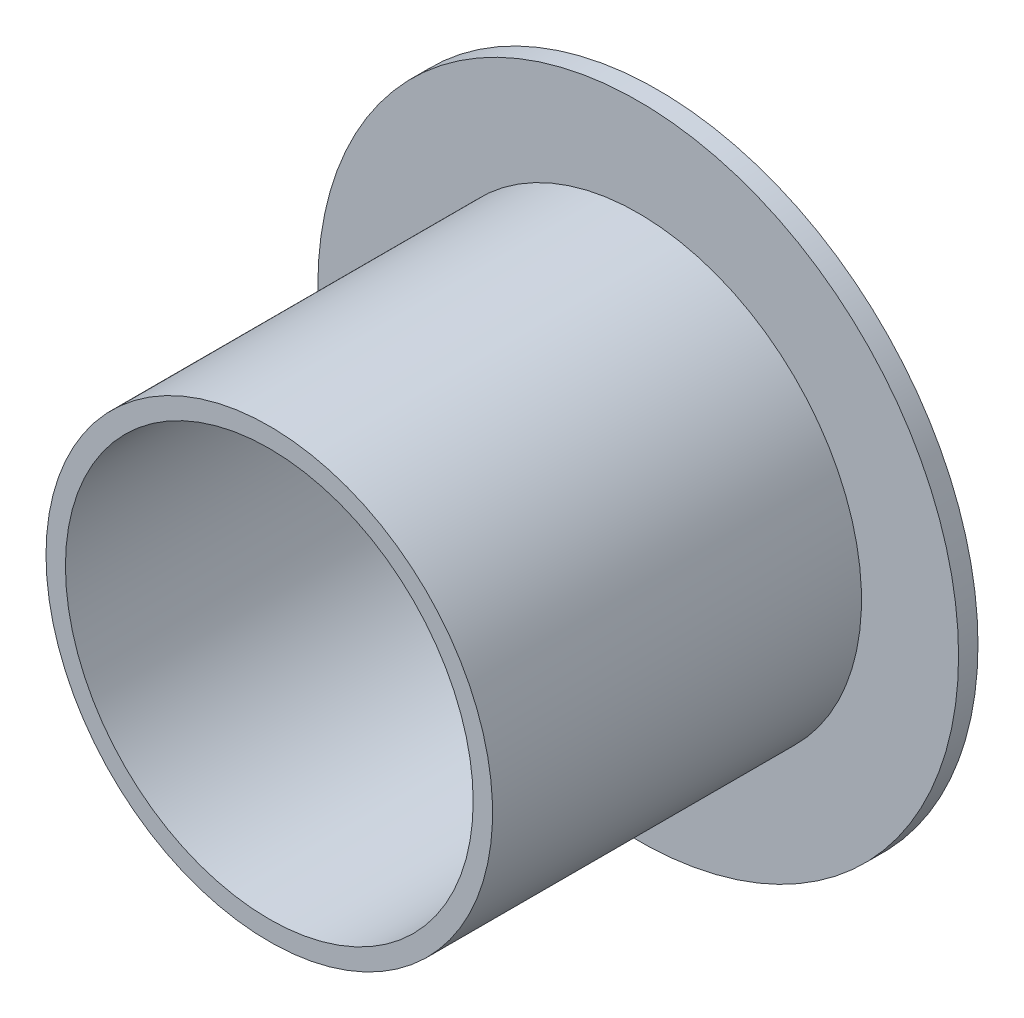
ISO-10303-21;
HEADER;
FILE_DESCRIPTION(('STEP AP214'),'2;1');
FILE_NAME('part.step','',(''),(''),'','','');
FILE_SCHEMA(('AUTOMOTIVE_DESIGN { 1 0 10303 214 1 1 1 1 }'));
ENDSEC;
DATA;
#1=APPLICATION_CONTEXT('core data for automotive mechanical design processes');
#2=APPLICATION_PROTOCOL_DEFINITION('international standard','automotive_design',2000,#1);
#3=PRODUCT_CONTEXT('',#1,'mechanical');
#4=PRODUCT('Part','Part','',(#3));
#5=PRODUCT_RELATED_PRODUCT_CATEGORY('part','',(#4));
#6=PRODUCT_DEFINITION_FORMATION('','',#4);
#7=PRODUCT_DEFINITION_CONTEXT('part definition',#1,'design');
#8=PRODUCT_DEFINITION('design','',#6,#7);
#9=PRODUCT_DEFINITION_SHAPE('','',#8);
#10=(LENGTH_UNIT() NAMED_UNIT(*) SI_UNIT(.MILLI.,.METRE.));
#11=(NAMED_UNIT(*) PLANE_ANGLE_UNIT() SI_UNIT($,.RADIAN.));
#12=(NAMED_UNIT(*) SI_UNIT($,.STERADIAN.) SOLID_ANGLE_UNIT());
#13=UNCERTAINTY_MEASURE_WITH_UNIT(LENGTH_MEASURE(1.E-05),#10,'distance_accuracy_value','');
#14=(GEOMETRIC_REPRESENTATION_CONTEXT(3) GLOBAL_UNCERTAINTY_ASSIGNED_CONTEXT((#13)) GLOBAL_UNIT_ASSIGNED_CONTEXT((#10,
#11,#12)) REPRESENTATION_CONTEXT('',''));
#15=CARTESIAN_POINT('',(0.,0.,0.));
#16=DIRECTION('',(0.,0.,1.));
#17=DIRECTION('',(1.,0.,0.));
#18=AXIS2_PLACEMENT_3D('',#15,#16,#17);
#19=CARTESIAN_POINT('',(-10.5,0.,0.));
#20=DIRECTION('',(0.,0.,-1.));
#21=DIRECTION('',(-1.,0.,0.));
#22=AXIS2_PLACEMENT_3D('',#19,#20,#21);
#23=CYLINDRICAL_SURFACE('',#22,10.5);
#24=CARTESIAN_POINT('',(-10.5,0.,20.));
#25=DIRECTION('',(0.,0.,-1.));
#26=DIRECTION('',(-1.,0.,0.));
#27=AXIS2_PLACEMENT_3D('',#24,#25,#26);
#28=CIRCLE('',#27,10.5);
#29=CARTESIAN_POINT('',(-21.,0.,20.));
#30=VERTEX_POINT('',#29);
#31=EDGE_CURVE('E59',#30,#30,#28,.T.);
#32=ORIENTED_EDGE('',*,*,#31,.F.);
#33=EDGE_LOOP('',(#32));
#34=FACE_BOUND('',#33,.T.);
#35=CARTESIAN_POINT('',(-10.5,0.,0.));
#36=DIRECTION('',(0.,0.,-1.));
#37=DIRECTION('',(-1.,0.,0.));
#38=AXIS2_PLACEMENT_3D('',#35,#36,#37);
#39=CIRCLE('',#38,10.5);
#40=CARTESIAN_POINT('',(-21.,0.,0.));
#41=VERTEX_POINT('',#40);
#42=EDGE_CURVE('E10',#41,#41,#39,.T.);
#43=ORIENTED_EDGE('',*,*,#42,.T.);
#44=EDGE_LOOP('',(#43));
#45=FACE_BOUND('',#44,.T.);
#46=ADVANCED_FACE('F37',(#34,#45),#23,.F.);
#47=CARTESIAN_POINT('',(0.,0.,0.));
#48=DIRECTION('',(0.,0.,1.));
#49=DIRECTION('',(1.,0.,0.));
#50=AXIS2_PLACEMENT_3D('',#47,#48,#49);
#51=PLANE('',#50);
#52=ORIENTED_EDGE('',*,*,#42,.F.);
#53=EDGE_LOOP('',(#52));
#54=FACE_BOUND('',#53,.T.);
#55=CARTESIAN_POINT('',(-10.5,0.,0.));
#56=DIRECTION('',(0.,0.,-1.));
#57=DIRECTION('',(-1.,0.,0.));
#58=AXIS2_PLACEMENT_3D('',#55,#56,#57);
#59=CIRCLE('',#58,16.5);
#60=CARTESIAN_POINT('',(-27.,0.,0.));
#61=VERTEX_POINT('',#60);
#62=EDGE_CURVE('E43',#61,#61,#59,.T.);
#63=ORIENTED_EDGE('',*,*,#62,.T.);
#64=EDGE_LOOP('',(#63));
#65=FACE_BOUND('',#64,.T.);
#66=ADVANCED_FACE('F66',(#54,#65),#51,.F.);
#67=CARTESIAN_POINT('',(-10.5,0.,0.));
#68=DIRECTION('',(0.,0.,-1.));
#69=DIRECTION('',(-1.,0.,0.));
#70=AXIS2_PLACEMENT_3D('',#67,#68,#69);
#71=CYLINDRICAL_SURFACE('',#70,16.5);
#72=ORIENTED_EDGE('',*,*,#62,.F.);
#73=EDGE_LOOP('',(#72));
#74=FACE_BOUND('',#73,.T.);
#75=CARTESIAN_POINT('',(-10.5,0.,1.));
#76=DIRECTION('',(0.,0.,-1.));
#77=DIRECTION('',(-1.,0.,0.));
#78=AXIS2_PLACEMENT_3D('',#75,#76,#77);
#79=CIRCLE('',#78,16.5);
#80=CARTESIAN_POINT('',(-27.,0.,1.00000000000001));
#81=VERTEX_POINT('',#80);
#82=EDGE_CURVE('E47',#81,#81,#79,.T.);
#83=ORIENTED_EDGE('',*,*,#82,.T.);
#84=EDGE_LOOP('',(#83));
#85=FACE_BOUND('',#84,.T.);
#86=ADVANCED_FACE('F70',(#74,#85),#71,.T.);
#87=CARTESIAN_POINT('',(6.,0.,1.));
#88=DIRECTION('',(0.,0.,-1.));
#89=DIRECTION('',(-1.,0.,0.));
#90=AXIS2_PLACEMENT_3D('',#87,#88,#89);
#91=PLANE('',#90);
#92=ORIENTED_EDGE('',*,*,#82,.F.);
#93=EDGE_LOOP('',(#92));
#94=FACE_BOUND('',#93,.T.);
#95=CARTESIAN_POINT('',(-10.5,0.,1.));
#96=DIRECTION('',(0.,0.,-1.));
#97=DIRECTION('',(-1.,0.,0.));
#98=AXIS2_PLACEMENT_3D('',#95,#96,#97);
#99=CIRCLE('',#98,11.5);
#100=CARTESIAN_POINT('',(-22.,0.,1.00000000000001));
#101=VERTEX_POINT('',#100);
#102=EDGE_CURVE('E51',#101,#101,#99,.T.);
#103=ORIENTED_EDGE('',*,*,#102,.T.);
#104=EDGE_LOOP('',(#103));
#105=FACE_BOUND('',#104,.T.);
#106=ADVANCED_FACE('F75',(#94,#105),#91,.F.);
#107=CARTESIAN_POINT('',(-10.5,0.,0.));
#108=DIRECTION('',(0.,0.,-1.));
#109=DIRECTION('',(-1.,0.,0.));
#110=AXIS2_PLACEMENT_3D('',#107,#108,#109);
#111=CYLINDRICAL_SURFACE('',#110,11.5);
#112=ORIENTED_EDGE('',*,*,#102,.F.);
#113=EDGE_LOOP('',(#112));
#114=FACE_BOUND('',#113,.T.);
#115=CARTESIAN_POINT('',(-10.5,0.,20.));
#116=DIRECTION('',(0.,0.,-1.));
#117=DIRECTION('',(-1.,0.,0.));
#118=AXIS2_PLACEMENT_3D('',#115,#116,#117);
#119=CIRCLE('',#118,11.5);
#120=CARTESIAN_POINT('',(-22.,0.,20.));
#121=VERTEX_POINT('',#120);
#122=EDGE_CURVE('E56',#121,#121,#119,.T.);
#123=ORIENTED_EDGE('',*,*,#122,.T.);
#124=EDGE_LOOP('',(#123));
#125=FACE_BOUND('',#124,.T.);
#126=ADVANCED_FACE('F81',(#114,#125),#111,.T.);
#127=CARTESIAN_POINT('',(1.00000000000001,0.,20.));
#128=DIRECTION('',(0.,0.,-1.));
#129=DIRECTION('',(-1.,0.,0.));
#130=AXIS2_PLACEMENT_3D('',#127,#128,#129);
#131=PLANE('',#130);
#132=ORIENTED_EDGE('',*,*,#122,.F.);
#133=EDGE_LOOP('',(#132));
#134=FACE_BOUND('',#133,.T.);
#135=ORIENTED_EDGE('',*,*,#31,.T.);
#136=EDGE_LOOP('',(#135));
#137=FACE_BOUND('',#136,.T.);
#138=ADVANCED_FACE('F63',(#134,#137),#131,.F.);
#139=CLOSED_SHELL('',(#46,#66,#86,#106,#126,#138));
#140=MANIFOLD_SOLID_BREP('B2',#139);
#141=ADVANCED_BREP_SHAPE_REPRESENTATION('',(#18,#140),#14);
#142=SHAPE_DEFINITION_REPRESENTATION(#9,#141);
ENDSEC;
END-ISO-10303-21;
